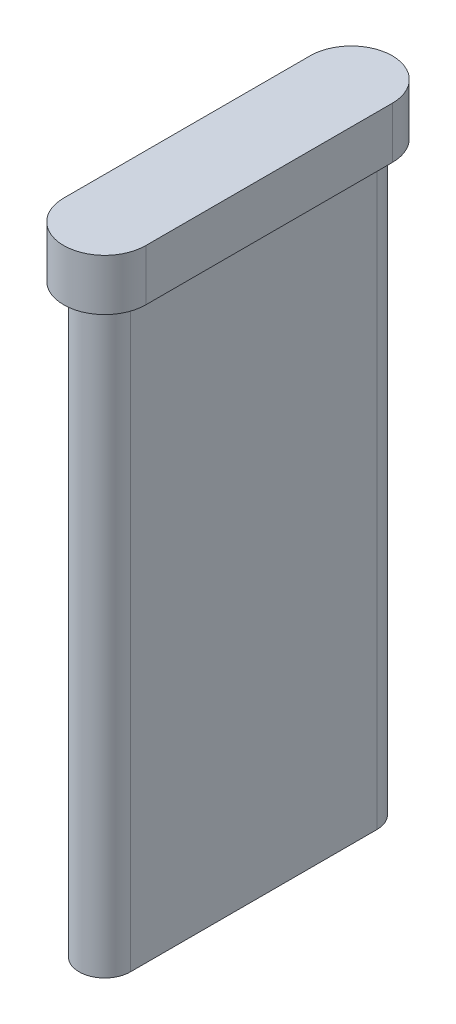
ISO-10303-21;
HEADER;
FILE_DESCRIPTION(('STEP AP214'),'2;1');
FILE_NAME('part.step','',(''),(''),'','','');
FILE_SCHEMA(('AUTOMOTIVE_DESIGN { 1 0 10303 214 1 1 1 1 }'));
ENDSEC;
DATA;
#1=APPLICATION_CONTEXT('core data for automotive mechanical design processes');
#2=APPLICATION_PROTOCOL_DEFINITION('international standard','automotive_design',2000,#1);
#3=PRODUCT_CONTEXT('',#1,'mechanical');
#4=PRODUCT('Part','Part','',(#3));
#5=PRODUCT_RELATED_PRODUCT_CATEGORY('part','',(#4));
#6=PRODUCT_DEFINITION_FORMATION('','',#4);
#7=PRODUCT_DEFINITION_CONTEXT('part definition',#1,'design');
#8=PRODUCT_DEFINITION('design','',#6,#7);
#9=PRODUCT_DEFINITION_SHAPE('','',#8);
#10=(LENGTH_UNIT() NAMED_UNIT(*) SI_UNIT(.MILLI.,.METRE.));
#11=(NAMED_UNIT(*) PLANE_ANGLE_UNIT() SI_UNIT($,.RADIAN.));
#12=(NAMED_UNIT(*) SI_UNIT($,.STERADIAN.) SOLID_ANGLE_UNIT());
#13=UNCERTAINTY_MEASURE_WITH_UNIT(LENGTH_MEASURE(1.E-05),#10,'distance_accuracy_value','');
#14=(GEOMETRIC_REPRESENTATION_CONTEXT(3) GLOBAL_UNCERTAINTY_ASSIGNED_CONTEXT((#13)) GLOBAL_UNIT_ASSIGNED_CONTEXT((#10,
#11,#12)) REPRESENTATION_CONTEXT('',''));
#15=CARTESIAN_POINT('',(0.,0.,0.));
#16=DIRECTION('',(0.,0.,1.));
#17=DIRECTION('',(1.,0.,0.));
#18=AXIS2_PLACEMENT_3D('',#15,#16,#17);
#19=CARTESIAN_POINT('',(0.,-62.,12.));
#20=DIRECTION('',(0.,1.,0.));
#21=DIRECTION('',(0.,0.,1.));
#22=AXIS2_PLACEMENT_3D('',#19,#20,#21);
#23=CYLINDRICAL_SURFACE('',#22,2.50000000000001);
#24=DIRECTION('',(0.,1.,0.));
#25=VECTOR('',#24,1.);
#26=CARTESIAN_POINT('',(2.50000000000001,-62.,12.));
#27=LINE('',#26,#25);
#28=CARTESIAN_POINT('',(2.50000000000001,-62.,12.));
#29=VERTEX_POINT('',#28);
#30=CARTESIAN_POINT('',(2.50000000000001,-5.,12.));
#31=VERTEX_POINT('',#30);
#32=EDGE_CURVE('E164',#29,#31,#27,.T.);
#33=ORIENTED_EDGE('',*,*,#32,.T.);
#34=CARTESIAN_POINT('',(0.,-5.,12.));
#35=DIRECTION('',(0.,1.,0.));
#36=DIRECTION('',(0.,0.,1.));
#37=AXIS2_PLACEMENT_3D('',#34,#35,#36);
#38=CIRCLE('',#37,2.50000000000001);
#39=CARTESIAN_POINT('',(-2.50000000000001,-5.,12.));
#40=VERTEX_POINT('',#39);
#41=EDGE_CURVE('E55',#31,#40,#38,.F.);
#42=ORIENTED_EDGE('',*,*,#41,.T.);
#43=DIRECTION('',(0.,1.,0.));
#44=VECTOR('',#43,1.);
#45=CARTESIAN_POINT('',(-2.50000000000001,-62.,12.));
#46=LINE('',#45,#44);
#47=CARTESIAN_POINT('',(-2.50000000000001,-62.,12.));
#48=VERTEX_POINT('',#47);
#49=EDGE_CURVE('E48',#48,#40,#46,.T.);
#50=ORIENTED_EDGE('',*,*,#49,.F.);
#51=CARTESIAN_POINT('',(0.,-62.,12.));
#52=DIRECTION('',(0.,1.,0.));
#53=DIRECTION('',(0.,0.,1.));
#54=AXIS2_PLACEMENT_3D('',#51,#52,#53);
#55=CIRCLE('',#54,2.50000000000001);
#56=EDGE_CURVE('E153',#48,#29,#55,.T.);
#57=ORIENTED_EDGE('',*,*,#56,.T.);
#58=EDGE_LOOP('',(#33,#42,#50,#57));
#59=FACE_BOUND('',#58,.T.);
#60=ADVANCED_FACE('F41',(#59),#23,.T.);
#61=CARTESIAN_POINT('',(-2.50000000000001,-62.,12.));
#62=DIRECTION('',(-1.,0.,0.));
#63=DIRECTION('',(0.,0.,1.));
#64=AXIS2_PLACEMENT_3D('',#61,#62,#63);
#65=PLANE('',#64);
#66=ORIENTED_EDGE('',*,*,#49,.T.);
#67=DIRECTION('',(0.,0.,-1.));
#68=VECTOR('',#67,1.);
#69=CARTESIAN_POINT('',(-2.50000000000001,-5.,12.));
#70=LINE('',#69,#68);
#71=CARTESIAN_POINT('',(-2.50000000000001,-5.,-12.));
#72=VERTEX_POINT('',#71);
#73=EDGE_CURVE('E149',#40,#72,#70,.T.);
#74=ORIENTED_EDGE('',*,*,#73,.T.);
#75=DIRECTION('',(0.,1.,0.));
#76=VECTOR('',#75,1.);
#77=CARTESIAN_POINT('',(-2.50000000000001,-62.,-12.));
#78=LINE('',#77,#76);
#79=CARTESIAN_POINT('',(-2.50000000000001,-62.,-12.));
#80=VERTEX_POINT('',#79);
#81=EDGE_CURVE('E166',#80,#72,#78,.T.);
#82=ORIENTED_EDGE('',*,*,#81,.F.);
#83=DIRECTION('',(0.,0.,1.));
#84=VECTOR('',#83,1.);
#85=CARTESIAN_POINT('',(-2.50000000000001,-62.,12.));
#86=LINE('',#85,#84);
#87=EDGE_CURVE('E161',#80,#48,#86,.T.);
#88=ORIENTED_EDGE('',*,*,#87,.T.);
#89=EDGE_LOOP('',(#66,#74,#82,#88));
#90=FACE_BOUND('',#89,.T.);
#91=ADVANCED_FACE('F182',(#90),#65,.T.);
#92=CARTESIAN_POINT('',(0.,-62.,-12.));
#93=DIRECTION('',(0.,1.,0.));
#94=DIRECTION('',(0.,0.,1.));
#95=AXIS2_PLACEMENT_3D('',#92,#93,#94);
#96=CYLINDRICAL_SURFACE('',#95,2.50000000000001);
#97=ORIENTED_EDGE('',*,*,#81,.T.);
#98=CARTESIAN_POINT('',(0.,-5.,-12.));
#99=DIRECTION('',(0.,1.,0.));
#100=DIRECTION('',(0.,0.,1.));
#101=AXIS2_PLACEMENT_3D('',#98,#99,#100);
#102=CIRCLE('',#101,2.50000000000001);
#103=CARTESIAN_POINT('',(2.5,-5.,-12.));
#104=VERTEX_POINT('',#103);
#105=EDGE_CURVE('E143',#72,#104,#102,.F.);
#106=ORIENTED_EDGE('',*,*,#105,.T.);
#107=DIRECTION('',(0.,1.,0.));
#108=VECTOR('',#107,1.);
#109=CARTESIAN_POINT('',(2.50000000000001,-62.,-12.));
#110=LINE('',#109,#108);
#111=CARTESIAN_POINT('',(2.50000000000001,-62.,-12.));
#112=VERTEX_POINT('',#111);
#113=EDGE_CURVE('E169',#112,#104,#110,.T.);
#114=ORIENTED_EDGE('',*,*,#113,.F.);
#115=CARTESIAN_POINT('',(0.,-62.,-12.));
#116=DIRECTION('',(0.,1.,0.));
#117=DIRECTION('',(0.,0.,1.));
#118=AXIS2_PLACEMENT_3D('',#115,#116,#117);
#119=CIRCLE('',#118,2.50000000000001);
#120=EDGE_CURVE('E158',#112,#80,#119,.T.);
#121=ORIENTED_EDGE('',*,*,#120,.T.);
#122=EDGE_LOOP('',(#97,#106,#114,#121));
#123=FACE_BOUND('',#122,.T.);
#124=ADVANCED_FACE('F180',(#123),#96,.T.);
#125=CARTESIAN_POINT('',(2.50000000000001,-62.,12.));
#126=DIRECTION('',(1.,0.,0.));
#127=DIRECTION('',(0.,0.,-1.));
#128=AXIS2_PLACEMENT_3D('',#125,#126,#127);
#129=PLANE('',#128);
#130=ORIENTED_EDGE('',*,*,#113,.T.);
#131=DIRECTION('',(0.,0.,1.));
#132=VECTOR('',#131,1.);
#133=CARTESIAN_POINT('',(2.50000000000001,-5.,12.));
#134=LINE('',#133,#132);
#135=EDGE_CURVE('E11',#104,#31,#134,.T.);
#136=ORIENTED_EDGE('',*,*,#135,.T.);
#137=ORIENTED_EDGE('',*,*,#32,.F.);
#138=DIRECTION('',(0.,0.,-1.));
#139=VECTOR('',#138,1.);
#140=CARTESIAN_POINT('',(2.50000000000001,-62.,12.));
#141=LINE('',#140,#139);
#142=EDGE_CURVE('E155',#29,#112,#141,.T.);
#143=ORIENTED_EDGE('',*,*,#142,.T.);
#144=EDGE_LOOP('',(#130,#136,#137,#143));
#145=FACE_BOUND('',#144,.T.);
#146=ADVANCED_FACE('F174',(#145),#129,.T.);
#147=CARTESIAN_POINT('',(0.,-62.,12.));
#148=DIRECTION('',(0.,1.,0.));
#149=DIRECTION('',(0.,0.,1.));
#150=AXIS2_PLACEMENT_3D('',#147,#148,#149);
#151=PLANE('',#150);
#152=ORIENTED_EDGE('',*,*,#56,.F.);
#153=ORIENTED_EDGE('',*,*,#87,.F.);
#154=ORIENTED_EDGE('',*,*,#120,.F.);
#155=ORIENTED_EDGE('',*,*,#142,.F.);
#156=EDGE_LOOP('',(#152,#153,#154,#155));
#157=FACE_BOUND('',#156,.T.);
#158=ADVANCED_FACE('F177',(#157),#151,.F.);
#159=CARTESIAN_POINT('',(0.,-5.,12.));
#160=DIRECTION('',(0.,1.,0.));
#161=DIRECTION('',(0.,0.,1.));
#162=AXIS2_PLACEMENT_3D('',#159,#160,#161);
#163=CYLINDRICAL_SURFACE('',#162,4.00000000000001);
#164=CARTESIAN_POINT('',(0.,0.,12.));
#165=DIRECTION('',(0.,1.,0.));
#166=DIRECTION('',(0.,0.,1.));
#167=AXIS2_PLACEMENT_3D('',#164,#165,#166);
#168=CIRCLE('',#167,4.00000000000001);
#169=CARTESIAN_POINT('',(-4.00000000000001,0.,12.));
#170=VERTEX_POINT('',#169);
#171=CARTESIAN_POINT('',(4.00000000000001,0.,12.));
#172=VERTEX_POINT('',#171);
#173=EDGE_CURVE('E137',#170,#172,#168,.T.);
#174=ORIENTED_EDGE('',*,*,#173,.F.);
#175=DIRECTION('',(0.,1.,0.));
#176=VECTOR('',#175,1.);
#177=CARTESIAN_POINT('',(-4.00000000000001,-5.,12.));
#178=LINE('',#177,#176);
#179=CARTESIAN_POINT('',(-4.00000000000001,-5.,12.));
#180=VERTEX_POINT('',#179);
#181=EDGE_CURVE('E128',#180,#170,#178,.T.);
#182=ORIENTED_EDGE('',*,*,#181,.F.);
#183=CARTESIAN_POINT('',(0.,-5.,12.));
#184=DIRECTION('',(0.,1.,0.));
#185=DIRECTION('',(0.,0.,1.));
#186=AXIS2_PLACEMENT_3D('',#183,#184,#185);
#187=CIRCLE('',#186,4.00000000000001);
#188=CARTESIAN_POINT('',(4.00000000000001,-5.,12.));
#189=VERTEX_POINT('',#188);
#190=EDGE_CURVE('E122',#180,#189,#187,.T.);
#191=ORIENTED_EDGE('',*,*,#190,.T.);
#192=DIRECTION('',(0.,1.,0.));
#193=VECTOR('',#192,1.);
#194=CARTESIAN_POINT('',(4.00000000000001,-5.,12.));
#195=LINE('',#194,#193);
#196=EDGE_CURVE('E104',#189,#172,#195,.T.);
#197=ORIENTED_EDGE('',*,*,#196,.T.);
#198=EDGE_LOOP('',(#174,#182,#191,#197));
#199=FACE_BOUND('',#198,.T.);
#200=ADVANCED_FACE('F127',(#199),#163,.T.);
#201=CARTESIAN_POINT('',(-4.00000000000001,-5.,-12.));
#202=DIRECTION('',(-1.,0.,0.));
#203=DIRECTION('',(0.,0.,1.));
#204=AXIS2_PLACEMENT_3D('',#201,#202,#203);
#205=PLANE('',#204);
#206=DIRECTION('',(0.,0.,1.));
#207=VECTOR('',#206,1.);
#208=CARTESIAN_POINT('',(-4.00000000000001,0.,-12.));
#209=LINE('',#208,#207);
#210=CARTESIAN_POINT('',(-4.00000000000001,0.,-12.));
#211=VERTEX_POINT('',#210);
#212=EDGE_CURVE('E129',#211,#170,#209,.T.);
#213=ORIENTED_EDGE('',*,*,#212,.F.);
#214=DIRECTION('',(0.,1.,0.));
#215=VECTOR('',#214,1.);
#216=CARTESIAN_POINT('',(-4.00000000000001,-5.,-12.));
#217=LINE('',#216,#215);
#218=CARTESIAN_POINT('',(-4.00000000000001,-5.,-12.));
#219=VERTEX_POINT('',#218);
#220=EDGE_CURVE('E144',#219,#211,#217,.T.);
#221=ORIENTED_EDGE('',*,*,#220,.F.);
#222=DIRECTION('',(0.,0.,1.));
#223=VECTOR('',#222,1.);
#224=CARTESIAN_POINT('',(-4.00000000000001,-5.,-12.));
#225=LINE('',#224,#223);
#226=EDGE_CURVE('E115',#219,#180,#225,.T.);
#227=ORIENTED_EDGE('',*,*,#226,.T.);
#228=ORIENTED_EDGE('',*,*,#181,.T.);
#229=EDGE_LOOP('',(#213,#221,#227,#228));
#230=FACE_BOUND('',#229,.T.);
#231=ADVANCED_FACE('F200',(#230),#205,.T.);
#232=CARTESIAN_POINT('',(0.,-5.,-12.));
#233=DIRECTION('',(0.,1.,0.));
#234=DIRECTION('',(0.,0.,1.));
#235=AXIS2_PLACEMENT_3D('',#232,#233,#234);
#236=CYLINDRICAL_SURFACE('',#235,4.00000000000001);
#237=CARTESIAN_POINT('',(0.,0.,-12.));
#238=DIRECTION('',(0.,1.,0.));
#239=DIRECTION('',(0.,0.,1.));
#240=AXIS2_PLACEMENT_3D('',#237,#238,#239);
#241=CIRCLE('',#240,4.00000000000001);
#242=CARTESIAN_POINT('',(4.00000000000001,0.,-12.));
#243=VERTEX_POINT('',#242);
#244=EDGE_CURVE('E132',#243,#211,#241,.T.);
#245=ORIENTED_EDGE('',*,*,#244,.F.);
#246=DIRECTION('',(0.,1.,0.));
#247=VECTOR('',#246,1.);
#248=CARTESIAN_POINT('',(4.00000000000001,-5.,-12.));
#249=LINE('',#248,#247);
#250=CARTESIAN_POINT('',(4.00000000000001,-5.,-12.));
#251=VERTEX_POINT('',#250);
#252=EDGE_CURVE('E114',#251,#243,#249,.T.);
#253=ORIENTED_EDGE('',*,*,#252,.F.);
#254=CARTESIAN_POINT('',(0.,-5.,-12.));
#255=DIRECTION('',(0.,1.,0.));
#256=DIRECTION('',(0.,0.,1.));
#257=AXIS2_PLACEMENT_3D('',#254,#255,#256);
#258=CIRCLE('',#257,4.00000000000001);
#259=EDGE_CURVE('E125',#251,#219,#258,.T.);
#260=ORIENTED_EDGE('',*,*,#259,.T.);
#261=ORIENTED_EDGE('',*,*,#220,.T.);
#262=EDGE_LOOP('',(#245,#253,#260,#261));
#263=FACE_BOUND('',#262,.T.);
#264=ADVANCED_FACE('F205',(#263),#236,.T.);
#265=CARTESIAN_POINT('',(4.00000000000001,-5.,12.));
#266=DIRECTION('',(1.,0.,0.));
#267=DIRECTION('',(0.,0.,-1.));
#268=AXIS2_PLACEMENT_3D('',#265,#266,#267);
#269=PLANE('',#268);
#270=DIRECTION('',(0.,0.,-1.));
#271=VECTOR('',#270,1.);
#272=CARTESIAN_POINT('',(4.00000000000001,0.,12.));
#273=LINE('',#272,#271);
#274=EDGE_CURVE('E109',#172,#243,#273,.T.);
#275=ORIENTED_EDGE('',*,*,#274,.F.);
#276=ORIENTED_EDGE('',*,*,#196,.F.);
#277=DIRECTION('',(0.,0.,-1.));
#278=VECTOR('',#277,1.);
#279=CARTESIAN_POINT('',(4.00000000000001,-5.,12.));
#280=LINE('',#279,#278);
#281=EDGE_CURVE('E107',#189,#251,#280,.T.);
#282=ORIENTED_EDGE('',*,*,#281,.T.);
#283=ORIENTED_EDGE('',*,*,#252,.T.);
#284=EDGE_LOOP('',(#275,#276,#282,#283));
#285=FACE_BOUND('',#284,.T.);
#286=ADVANCED_FACE('F106',(#285),#269,.T.);
#287=CARTESIAN_POINT('',(0.,-5.,12.));
#288=DIRECTION('',(0.,1.,0.));
#289=DIRECTION('',(0.,0.,1.));
#290=AXIS2_PLACEMENT_3D('',#287,#288,#289);
#291=PLANE('',#290);
#292=ORIENTED_EDGE('',*,*,#41,.F.);
#293=ORIENTED_EDGE('',*,*,#135,.F.);
#294=ORIENTED_EDGE('',*,*,#105,.F.);
#295=ORIENTED_EDGE('',*,*,#73,.F.);
#296=EDGE_LOOP('',(#292,#293,#294,#295));
#297=FACE_BOUND('',#296,.T.);
#298=ORIENTED_EDGE('',*,*,#190,.F.);
#299=ORIENTED_EDGE('',*,*,#226,.F.);
#300=ORIENTED_EDGE('',*,*,#259,.F.);
#301=ORIENTED_EDGE('',*,*,#281,.F.);
#302=EDGE_LOOP('',(#298,#299,#300,#301));
#303=FACE_BOUND('',#302,.T.);
#304=ADVANCED_FACE('F120',(#297,#303),#291,.F.);
#305=CARTESIAN_POINT('',(0.,0.,12.));
#306=DIRECTION('',(0.,1.,0.));
#307=DIRECTION('',(0.,0.,1.));
#308=AXIS2_PLACEMENT_3D('',#305,#306,#307);
#309=PLANE('',#308);
#310=ORIENTED_EDGE('',*,*,#173,.T.);
#311=ORIENTED_EDGE('',*,*,#274,.T.);
#312=ORIENTED_EDGE('',*,*,#244,.T.);
#313=ORIENTED_EDGE('',*,*,#212,.T.);
#314=EDGE_LOOP('',(#310,#311,#312,#313));
#315=FACE_BOUND('',#314,.T.);
#316=ADVANCED_FACE('F191',(#315),#309,.T.);
#317=CLOSED_SHELL('',(#60,#91,#124,#146,#158,#200,#231,#264,#286,#304,#316));
#318=MANIFOLD_SOLID_BREP('B2',#317);
#319=ADVANCED_BREP_SHAPE_REPRESENTATION('',(#18,#318),#14);
#320=SHAPE_DEFINITION_REPRESENTATION(#9,#319);
ENDSEC;
END-ISO-10303-21;
